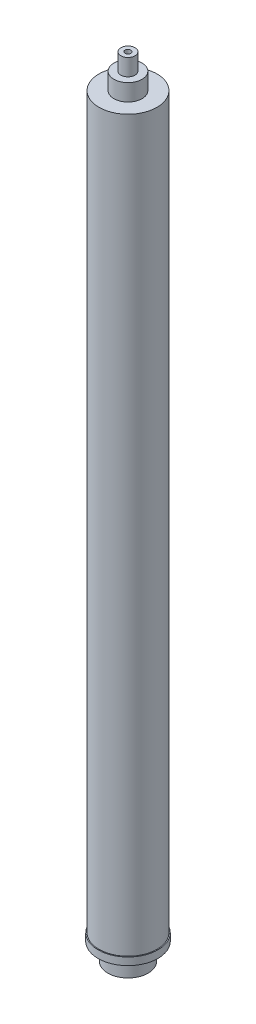
ISO-10303-21;
HEADER;
FILE_DESCRIPTION(('STEP AP214'),'2;1');
FILE_NAME('part.step','',(''),(''),'','','');
FILE_SCHEMA(('AUTOMOTIVE_DESIGN { 1 0 10303 214 1 1 1 1 }'));
ENDSEC;
DATA;
#1=APPLICATION_CONTEXT('core data for automotive mechanical design processes');
#2=APPLICATION_PROTOCOL_DEFINITION('international standard','automotive_design',2000,#1);
#3=PRODUCT_CONTEXT('',#1,'mechanical');
#4=PRODUCT('Part','Part','',(#3));
#5=PRODUCT_RELATED_PRODUCT_CATEGORY('part','',(#4));
#6=PRODUCT_DEFINITION_FORMATION('','',#4);
#7=PRODUCT_DEFINITION_CONTEXT('part definition',#1,'design');
#8=PRODUCT_DEFINITION('design','',#6,#7);
#9=PRODUCT_DEFINITION_SHAPE('','',#8);
#10=(LENGTH_UNIT() NAMED_UNIT(*) SI_UNIT(.MILLI.,.METRE.));
#11=(NAMED_UNIT(*) PLANE_ANGLE_UNIT() SI_UNIT($,.RADIAN.));
#12=(NAMED_UNIT(*) SI_UNIT($,.STERADIAN.) SOLID_ANGLE_UNIT());
#13=UNCERTAINTY_MEASURE_WITH_UNIT(LENGTH_MEASURE(1.E-05),#10,'distance_accuracy_value','');
#14=(GEOMETRIC_REPRESENTATION_CONTEXT(3) GLOBAL_UNCERTAINTY_ASSIGNED_CONTEXT((#13)) GLOBAL_UNIT_ASSIGNED_CONTEXT((#10,
#11,#12)) REPRESENTATION_CONTEXT('',''));
#15=CARTESIAN_POINT('',(0.,0.,0.));
#16=DIRECTION('',(0.,0.,1.));
#17=DIRECTION('',(1.,0.,0.));
#18=AXIS2_PLACEMENT_3D('',#15,#16,#17);
#19=CARTESIAN_POINT('',(0.,0.,0.));
#20=DIRECTION('',(0.,1.,0.));
#21=DIRECTION('',(0.,0.,1.));
#22=AXIS2_PLACEMENT_3D('',#19,#20,#21);
#23=PLANE('',#22);
#24=CARTESIAN_POINT('',(0.,0.,0.));
#25=DIRECTION('',(0.,1.,0.));
#26=DIRECTION('',(0.,0.,1.));
#27=AXIS2_PLACEMENT_3D('',#24,#25,#26);
#28=CIRCLE('',#27,4.95);
#29=CARTESIAN_POINT('',(0.,0.,4.95));
#30=VERTEX_POINT('',#29);
#31=EDGE_CURVE('E99',#30,#30,#28,.T.);
#32=ORIENTED_EDGE('',*,*,#31,.F.);
#33=EDGE_LOOP('',(#32));
#34=FACE_BOUND('',#33,.T.);
#35=CARTESIAN_POINT('',(0.,0.,0.));
#36=DIRECTION('',(0.,1.,0.));
#37=DIRECTION('',(0.,0.,1.));
#38=AXIS2_PLACEMENT_3D('',#35,#36,#37);
#39=CIRCLE('',#38,11.938);
#40=CARTESIAN_POINT('',(0.,0.,11.938));
#41=VERTEX_POINT('',#40);
#42=EDGE_CURVE('E10',#41,#41,#39,.T.);
#43=ORIENTED_EDGE('',*,*,#42,.T.);
#44=EDGE_LOOP('',(#43));
#45=FACE_BOUND('',#44,.T.);
#46=ADVANCED_FACE('F51',(#34,#45),#23,.T.);
#47=CARTESIAN_POINT('',(0.,0.,0.));
#48=DIRECTION('',(0.,1.,0.));
#49=DIRECTION('',(0.,0.,1.));
#50=AXIS2_PLACEMENT_3D('',#47,#48,#49);
#51=CYLINDRICAL_SURFACE('',#50,11.938);
#52=CARTESIAN_POINT('',(0.,-28.575,0.));
#53=DIRECTION('',(0.,1.,0.));
#54=DIRECTION('',(0.,0.,1.));
#55=AXIS2_PLACEMENT_3D('',#52,#53,#54);
#56=CIRCLE('',#55,11.938);
#57=CARTESIAN_POINT('',(0.,-28.575,11.938));
#58=VERTEX_POINT('',#57);
#59=EDGE_CURVE('E58',#58,#58,#56,.T.);
#60=ORIENTED_EDGE('',*,*,#59,.T.);
#61=EDGE_LOOP('',(#60));
#62=FACE_BOUND('',#61,.T.);
#63=ORIENTED_EDGE('',*,*,#42,.F.);
#64=EDGE_LOOP('',(#63));
#65=FACE_BOUND('',#64,.T.);
#66=ADVANCED_FACE('F176',(#62,#65),#51,.T.);
#67=CARTESIAN_POINT('',(0.,-28.575,11.938));
#68=DIRECTION('',(0.,1.,0.));
#69=DIRECTION('',(0.,0.,1.));
#70=AXIS2_PLACEMENT_3D('',#67,#68,#69);
#71=PLANE('',#70);
#72=CARTESIAN_POINT('',(0.,-28.575,0.));
#73=DIRECTION('',(0.,1.,0.));
#74=DIRECTION('',(0.,0.,1.));
#75=AXIS2_PLACEMENT_3D('',#72,#73,#74);
#76=CIRCLE('',#75,23.876);
#77=CARTESIAN_POINT('',(0.,-28.575,23.876));
#78=VERTEX_POINT('',#77);
#79=EDGE_CURVE('E63',#78,#78,#76,.T.);
#80=ORIENTED_EDGE('',*,*,#79,.T.);
#81=EDGE_LOOP('',(#80));
#82=FACE_BOUND('',#81,.T.);
#83=ORIENTED_EDGE('',*,*,#59,.F.);
#84=EDGE_LOOP('',(#83));
#85=FACE_BOUND('',#84,.T.);
#86=ADVANCED_FACE('F170',(#82,#85),#71,.T.);
#87=CARTESIAN_POINT('',(0.,0.,0.));
#88=DIRECTION('',(0.,1.,0.));
#89=DIRECTION('',(0.,0.,1.));
#90=AXIS2_PLACEMENT_3D('',#87,#88,#89);
#91=CYLINDRICAL_SURFACE('',#90,23.876);
#92=CARTESIAN_POINT('',(0.,-57.15,0.));
#93=DIRECTION('',(0.,1.,0.));
#94=DIRECTION('',(0.,0.,1.));
#95=AXIS2_PLACEMENT_3D('',#92,#93,#94);
#96=CIRCLE('',#95,23.876);
#97=CARTESIAN_POINT('',(0.,-57.15,23.876));
#98=VERTEX_POINT('',#97);
#99=EDGE_CURVE('E68',#98,#98,#96,.T.);
#100=ORIENTED_EDGE('',*,*,#99,.T.);
#101=EDGE_LOOP('',(#100));
#102=FACE_BOUND('',#101,.T.);
#103=ORIENTED_EDGE('',*,*,#79,.F.);
#104=EDGE_LOOP('',(#103));
#105=FACE_BOUND('',#104,.T.);
#106=ADVANCED_FACE('F164',(#102,#105),#91,.T.);
#107=CARTESIAN_POINT('',(0.,-57.15,23.876));
#108=DIRECTION('',(0.,1.,0.));
#109=DIRECTION('',(0.,0.,1.));
#110=AXIS2_PLACEMENT_3D('',#107,#108,#109);
#111=PLANE('',#110);
#112=CARTESIAN_POINT('',(0.,-57.15,0.));
#113=DIRECTION('',(0.,1.,0.));
#114=DIRECTION('',(0.,0.,1.));
#115=AXIS2_PLACEMENT_3D('',#112,#113,#114);
#116=CIRCLE('',#115,49.2125000000003);
#117=CARTESIAN_POINT('',(0.,-57.15,49.2125000000003));
#118=VERTEX_POINT('',#117);
#119=EDGE_CURVE('E74',#118,#118,#116,.T.);
#120=ORIENTED_EDGE('',*,*,#119,.T.);
#121=EDGE_LOOP('',(#120));
#122=FACE_BOUND('',#121,.T.);
#123=ORIENTED_EDGE('',*,*,#99,.F.);
#124=EDGE_LOOP('',(#123));
#125=FACE_BOUND('',#124,.T.);
#126=ADVANCED_FACE('F158',(#122,#125),#111,.T.);
#127=CARTESIAN_POINT('',(0.,0.,0.));
#128=DIRECTION('',(0.,1.,0.));
#129=DIRECTION('',(0.,0.,1.));
#130=AXIS2_PLACEMENT_3D('',#127,#128,#129);
#131=CYLINDRICAL_SURFACE('',#130,49.2125000000001);
#132=CARTESIAN_POINT('',(0.,-1295.654,0.));
#133=DIRECTION('',(0.,1.,0.));
#134=DIRECTION('',(0.,0.,1.));
#135=AXIS2_PLACEMENT_3D('',#132,#133,#134);
#136=CIRCLE('',#135,49.2125);
#137=CARTESIAN_POINT('',(0.,-1295.654,49.2125));
#138=VERTEX_POINT('',#137);
#139=EDGE_CURVE('E78',#138,#138,#136,.T.);
#140=ORIENTED_EDGE('',*,*,#139,.T.);
#141=EDGE_LOOP('',(#140));
#142=FACE_BOUND('',#141,.T.);
#143=ORIENTED_EDGE('',*,*,#119,.F.);
#144=EDGE_LOOP('',(#143));
#145=FACE_BOUND('',#144,.T.);
#146=ADVANCED_FACE('F152',(#142,#145),#131,.T.);
#147=CARTESIAN_POINT('',(0.,-1295.654,49.2125));
#148=DIRECTION('',(0.,1.,0.));
#149=DIRECTION('',(0.,0.,1.));
#150=AXIS2_PLACEMENT_3D('',#147,#148,#149);
#151=PLANE('',#150);
#152=CARTESIAN_POINT('',(0.,-1295.654,0.));
#153=DIRECTION('',(0.,1.,0.));
#154=DIRECTION('',(0.,0.,1.));
#155=AXIS2_PLACEMENT_3D('',#152,#153,#154);
#156=CIRCLE('',#155,50.8);
#157=CARTESIAN_POINT('',(0.,-1295.654,50.8));
#158=VERTEX_POINT('',#157);
#159=EDGE_CURVE('E82',#158,#158,#156,.T.);
#160=ORIENTED_EDGE('',*,*,#159,.T.);
#161=EDGE_LOOP('',(#160));
#162=FACE_BOUND('',#161,.T.);
#163=ORIENTED_EDGE('',*,*,#139,.F.);
#164=EDGE_LOOP('',(#163));
#165=FACE_BOUND('',#164,.T.);
#166=ADVANCED_FACE('F146',(#162,#165),#151,.T.);
#167=CARTESIAN_POINT('',(0.,0.,0.));
#168=DIRECTION('',(0.,1.,0.));
#169=DIRECTION('',(0.,0.,1.));
#170=AXIS2_PLACEMENT_3D('',#167,#168,#169);
#171=CYLINDRICAL_SURFACE('',#170,50.8);
#172=CARTESIAN_POINT('',(0.,-1308.354,0.));
#173=DIRECTION('',(0.,1.,0.));
#174=DIRECTION('',(0.,0.,1.));
#175=AXIS2_PLACEMENT_3D('',#172,#173,#174);
#176=CIRCLE('',#175,50.8);
#177=CARTESIAN_POINT('',(0.,-1308.354,50.8));
#178=VERTEX_POINT('',#177);
#179=EDGE_CURVE('E86',#178,#178,#176,.T.);
#180=ORIENTED_EDGE('',*,*,#179,.T.);
#181=EDGE_LOOP('',(#180));
#182=FACE_BOUND('',#181,.T.);
#183=ORIENTED_EDGE('',*,*,#159,.F.);
#184=EDGE_LOOP('',(#183));
#185=FACE_BOUND('',#184,.T.);
#186=ADVANCED_FACE('F140',(#182,#185),#171,.T.);
#187=CARTESIAN_POINT('',(0.,-1308.354,50.8));
#188=DIRECTION('',(0.,-1.,0.));
#189=DIRECTION('',(0.,0.,-1.));
#190=AXIS2_PLACEMENT_3D('',#187,#188,#189);
#191=PLANE('',#190);
#192=CARTESIAN_POINT('',(0.,-1308.354,0.));
#193=DIRECTION('',(0.,1.,0.));
#194=DIRECTION('',(0.,0.,1.));
#195=AXIS2_PLACEMENT_3D('',#192,#193,#194);
#196=CIRCLE('',#195,34.29);
#197=CARTESIAN_POINT('',(0.,-1308.354,34.29));
#198=VERTEX_POINT('',#197);
#199=EDGE_CURVE('E90',#198,#198,#196,.T.);
#200=ORIENTED_EDGE('',*,*,#199,.T.);
#201=EDGE_LOOP('',(#200));
#202=FACE_BOUND('',#201,.T.);
#203=ORIENTED_EDGE('',*,*,#179,.F.);
#204=EDGE_LOOP('',(#203));
#205=FACE_BOUND('',#204,.T.);
#206=ADVANCED_FACE('F134',(#202,#205),#191,.T.);
#207=CARTESIAN_POINT('',(0.,0.,0.));
#208=DIRECTION('',(0.,1.,0.));
#209=DIRECTION('',(0.,0.,1.));
#210=AXIS2_PLACEMENT_3D('',#207,#208,#209);
#211=CYLINDRICAL_SURFACE('',#210,34.29);
#212=CARTESIAN_POINT('',(0.,-1338.199,0.));
#213=DIRECTION('',(0.,1.,0.));
#214=DIRECTION('',(0.,0.,1.));
#215=AXIS2_PLACEMENT_3D('',#212,#213,#214);
#216=CIRCLE('',#215,34.29);
#217=CARTESIAN_POINT('',(0.,-1338.199,34.29));
#218=VERTEX_POINT('',#217);
#219=EDGE_CURVE('E94',#218,#218,#216,.T.);
#220=ORIENTED_EDGE('',*,*,#219,.T.);
#221=EDGE_LOOP('',(#220));
#222=FACE_BOUND('',#221,.T.);
#223=ORIENTED_EDGE('',*,*,#199,.F.);
#224=EDGE_LOOP('',(#223));
#225=FACE_BOUND('',#224,.T.);
#226=ADVANCED_FACE('F128',(#222,#225),#211,.T.);
#227=CARTESIAN_POINT('',(0.,-1338.199,34.29));
#228=DIRECTION('',(0.,-1.,0.));
#229=DIRECTION('',(0.,0.,-1.));
#230=AXIS2_PLACEMENT_3D('',#227,#228,#229);
#231=PLANE('',#230);
#232=CARTESIAN_POINT('',(0.,-1338.199,0.));
#233=DIRECTION('',(0.,-1.,0.));
#234=DIRECTION('',(0.,0.,-1.));
#235=AXIS2_PLACEMENT_3D('',#232,#233,#234);
#236=CIRCLE('',#235,27.5);
#237=CARTESIAN_POINT('',(0.,-1338.199,-27.5));
#238=VERTEX_POINT('',#237);
#239=EDGE_CURVE('E107',#238,#238,#236,.T.);
#240=ORIENTED_EDGE('',*,*,#239,.F.);
#241=EDGE_LOOP('',(#240));
#242=FACE_BOUND('',#241,.T.);
#243=ORIENTED_EDGE('',*,*,#219,.F.);
#244=EDGE_LOOP('',(#243));
#245=FACE_BOUND('',#244,.T.);
#246=ADVANCED_FACE('F124',(#242,#245),#231,.T.);
#247=CARTESIAN_POINT('',(0.,-25.4,0.));
#248=DIRECTION('',(0.,1.,0.));
#249=DIRECTION('',(0.,0.,1.));
#250=AXIS2_PLACEMENT_3D('',#247,#248,#249);
#251=CYLINDRICAL_SURFACE('',#250,4.95);
#252=CARTESIAN_POINT('',(0.,-25.4,0.));
#253=DIRECTION('',(0.,1.,0.));
#254=DIRECTION('',(0.,0.,1.));
#255=AXIS2_PLACEMENT_3D('',#252,#253,#254);
#256=CIRCLE('',#255,4.95);
#257=CARTESIAN_POINT('',(0.,-25.4,4.95));
#258=VERTEX_POINT('',#257);
#259=EDGE_CURVE('E98',#258,#258,#256,.T.);
#260=ORIENTED_EDGE('',*,*,#259,.F.);
#261=EDGE_LOOP('',(#260));
#262=FACE_BOUND('',#261,.T.);
#263=ORIENTED_EDGE('',*,*,#31,.T.);
#264=EDGE_LOOP('',(#263));
#265=FACE_BOUND('',#264,.T.);
#266=ADVANCED_FACE('F127',(#262,#265),#251,.F.);
#267=CARTESIAN_POINT('',(0.,-25.4,0.));
#268=DIRECTION('',(0.,1.,0.));
#269=DIRECTION('',(0.,0.,1.));
#270=AXIS2_PLACEMENT_3D('',#267,#268,#269);
#271=PLANE('',#270);
#272=ORIENTED_EDGE('',*,*,#259,.T.);
#273=EDGE_LOOP('',(#272));
#274=FACE_BOUND('',#273,.T.);
#275=ADVANCED_FACE('F120',(#274),#271,.T.);
#276=CARTESIAN_POINT('',(0.,-338.199,0.));
#277=DIRECTION('',(0.,-1.,0.));
#278=DIRECTION('',(0.,0.,-1.));
#279=AXIS2_PLACEMENT_3D('',#276,#277,#278);
#280=CYLINDRICAL_SURFACE('',#279,27.5);
#281=CARTESIAN_POINT('',(0.,-338.199,0.));
#282=DIRECTION('',(0.,-1.,0.));
#283=DIRECTION('',(0.,0.,-1.));
#284=AXIS2_PLACEMENT_3D('',#281,#282,#283);
#285=CIRCLE('',#284,27.5);
#286=CARTESIAN_POINT('',(0.,-338.199,-27.5));
#287=VERTEX_POINT('',#286);
#288=EDGE_CURVE('E103',#287,#287,#285,.T.);
#289=ORIENTED_EDGE('',*,*,#288,.F.);
#290=EDGE_LOOP('',(#289));
#291=FACE_BOUND('',#290,.T.);
#292=ORIENTED_EDGE('',*,*,#239,.T.);
#293=EDGE_LOOP('',(#292));
#294=FACE_BOUND('',#293,.T.);
#295=ADVANCED_FACE('F117',(#291,#294),#280,.F.);
#296=CARTESIAN_POINT('',(0.,-338.199,0.));
#297=DIRECTION('',(0.,-1.,0.));
#298=DIRECTION('',(0.,0.,-1.));
#299=AXIS2_PLACEMENT_3D('',#296,#297,#298);
#300=PLANE('',#299);
#301=ORIENTED_EDGE('',*,*,#288,.T.);
#302=EDGE_LOOP('',(#301));
#303=FACE_BOUND('',#302,.T.);
#304=ADVANCED_FACE('F115',(#303),#300,.T.);
#305=CLOSED_SHELL('',(#46,#66,#86,#106,#126,#146,#166,#186,#206,#226,#246,#266,#275,#295,#304));
#306=MANIFOLD_SOLID_BREP('B2',#305);
#307=ADVANCED_BREP_SHAPE_REPRESENTATION('',(#18,#306),#14);
#308=SHAPE_DEFINITION_REPRESENTATION(#9,#307);
ENDSEC;
END-ISO-10303-21;
